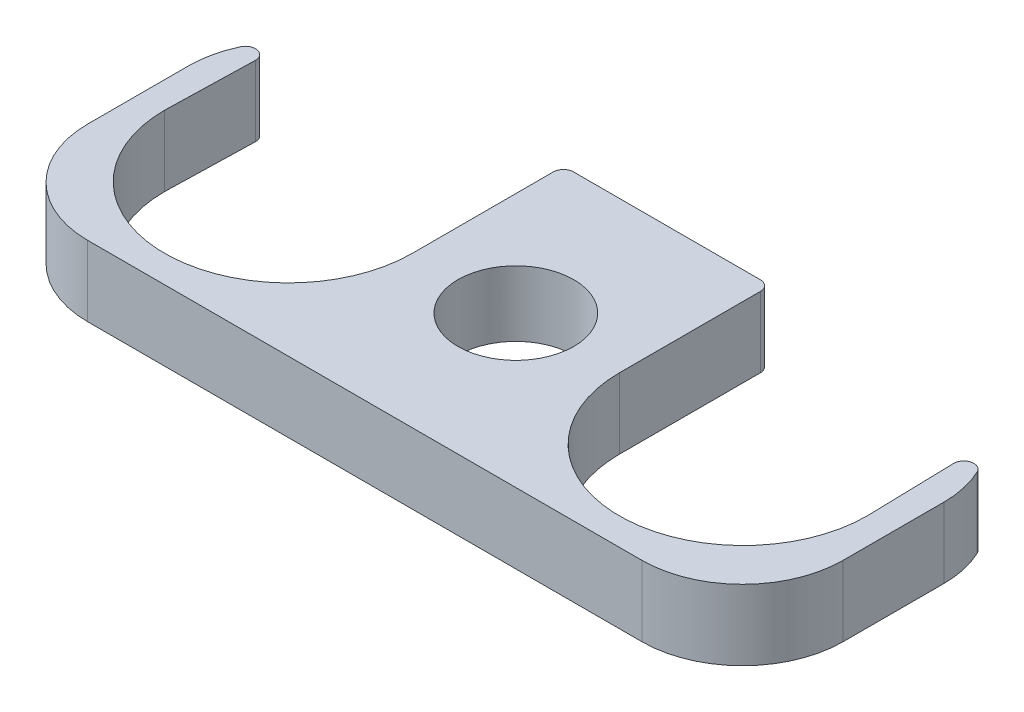
ISO-10303-21;
HEADER;
FILE_DESCRIPTION(('STEP AP214'),'2;1');
FILE_NAME('part.step','',(''),(''),'','','');
FILE_SCHEMA(('AUTOMOTIVE_DESIGN { 1 0 10303 214 1 1 1 1 }'));
ENDSEC;
DATA;
#1=APPLICATION_CONTEXT('core data for automotive mechanical design processes');
#2=APPLICATION_PROTOCOL_DEFINITION('international standard','automotive_design',2000,#1);
#3=PRODUCT_CONTEXT('',#1,'mechanical');
#4=PRODUCT('Part','Part','',(#3));
#5=PRODUCT_RELATED_PRODUCT_CATEGORY('part','',(#4));
#6=PRODUCT_DEFINITION_FORMATION('','',#4);
#7=PRODUCT_DEFINITION_CONTEXT('part definition',#1,'design');
#8=PRODUCT_DEFINITION('design','',#6,#7);
#9=PRODUCT_DEFINITION_SHAPE('','',#8);
#10=(LENGTH_UNIT() NAMED_UNIT(*) SI_UNIT(.MILLI.,.METRE.));
#11=(NAMED_UNIT(*) PLANE_ANGLE_UNIT() SI_UNIT($,.RADIAN.));
#12=(NAMED_UNIT(*) SI_UNIT($,.STERADIAN.) SOLID_ANGLE_UNIT());
#13=UNCERTAINTY_MEASURE_WITH_UNIT(LENGTH_MEASURE(1.E-05),#10,'distance_accuracy_value','');
#14=(GEOMETRIC_REPRESENTATION_CONTEXT(3) GLOBAL_UNCERTAINTY_ASSIGNED_CONTEXT((#13)) GLOBAL_UNIT_ASSIGNED_CONTEXT((#10,
#11,#12)) REPRESENTATION_CONTEXT('',''));
#15=CARTESIAN_POINT('',(0.,0.,0.));
#16=DIRECTION('',(0.,0.,1.));
#17=DIRECTION('',(1.,0.,0.));
#18=AXIS2_PLACEMENT_3D('',#15,#16,#17);
#19=CARTESIAN_POINT('',(0.,7.,0.));
#20=DIRECTION('',(0.,-1.,0.));
#21=DIRECTION('',(0.,0.,-1.));
#22=AXIS2_PLACEMENT_3D('',#19,#20,#21);
#23=CYLINDRICAL_SURFACE('',#22,5.75);
#24=CARTESIAN_POINT('',(0.,7.,0.));
#25=DIRECTION('',(0.,1.,0.));
#26=DIRECTION('',(0.,0.,1.));
#27=AXIS2_PLACEMENT_3D('',#24,#25,#26);
#28=CIRCLE('',#27,5.75);
#29=CARTESIAN_POINT('',(0.,7.,5.75));
#30=VERTEX_POINT('',#29);
#31=EDGE_CURVE('E297',#30,#30,#28,.T.);
#32=ORIENTED_EDGE('',*,*,#31,.T.);
#33=EDGE_LOOP('',(#32));
#34=FACE_BOUND('',#33,.T.);
#35=CARTESIAN_POINT('',(0.,0.5,0.));
#36=DIRECTION('',(0.,-1.,0.));
#37=DIRECTION('',(0.,0.,-1.));
#38=AXIS2_PLACEMENT_3D('',#35,#36,#37);
#39=CIRCLE('',#38,5.75);
#40=CARTESIAN_POINT('',(0.,0.5,-5.75));
#41=VERTEX_POINT('',#40);
#42=EDGE_CURVE('E44',#41,#41,#39,.T.);
#43=ORIENTED_EDGE('',*,*,#42,.T.);
#44=EDGE_LOOP('',(#43));
#45=FACE_BOUND('',#44,.T.);
#46=ADVANCED_FACE('F41',(#34,#45),#23,.F.);
#47=CARTESIAN_POINT('',(35.6536683910672,7.,-8.81020888777915));
#48=DIRECTION('',(0.,-1.,0.));
#49=DIRECTION('',(0.,0.,-1.));
#50=AXIS2_PLACEMENT_3D('',#47,#48,#49);
#51=CYLINDRICAL_SURFACE('',#50,1.);
#52=DIRECTION('',(0.,1.,0.));
#53=VECTOR('',#52,1.);
#54=CARTESIAN_POINT('',(34.6539865991295,7.,-8.78498360545808));
#55=LINE('',#54,#53);
#56=CARTESIAN_POINT('',(34.6539865991295,7.,-8.78498360545807));
#57=VERTEX_POINT('',#56);
#58=CARTESIAN_POINT('',(34.6539865991295,0.,-8.78498360545807));
#59=VERTEX_POINT('',#58);
#60=EDGE_CURVE('E383',#57,#59,#55,.F.);
#61=ORIENTED_EDGE('',*,*,#60,.F.);
#62=CARTESIAN_POINT('',(35.6536683910672,7.,-8.81020888777915));
#63=DIRECTION('',(0.,-1.,0.));
#64=DIRECTION('',(0.,0.,-1.));
#65=AXIS2_PLACEMENT_3D('',#62,#63,#64);
#66=CIRCLE('',#65,1.);
#67=CARTESIAN_POINT('',(36.5596315456303,7.,-9.23356543086571));
#68=VERTEX_POINT('',#67);
#69=EDGE_CURVE('E49',#68,#57,#66,.F.);
#70=ORIENTED_EDGE('',*,*,#69,.F.);
#71=DIRECTION('',(0.,-1.,0.));
#72=VECTOR('',#71,1.);
#73=CARTESIAN_POINT('',(36.5596315456303,7.,-9.23356543086571));
#74=LINE('',#73,#72);
#75=CARTESIAN_POINT('',(36.5596315456303,0.,-9.23356543086571));
#76=VERTEX_POINT('',#75);
#77=EDGE_CURVE('E390',#76,#68,#74,.F.);
#78=ORIENTED_EDGE('',*,*,#77,.F.);
#79=CARTESIAN_POINT('',(35.6536683910672,0.,-8.81020888777915));
#80=DIRECTION('',(0.,-1.,0.));
#81=DIRECTION('',(0.,0.,-1.));
#82=AXIS2_PLACEMENT_3D('',#79,#80,#81);
#83=CIRCLE('',#82,1.);
#84=EDGE_CURVE('E11',#59,#76,#83,.T.);
#85=ORIENTED_EDGE('',*,*,#84,.F.);
#86=EDGE_LOOP('',(#61,#70,#78,#85));
#87=FACE_BOUND('',#86,.T.);
#88=ADVANCED_FACE('F43',(#87),#51,.T.);
#89=CARTESIAN_POINT('',(9.27566082929035,7.,-14.));
#90=DIRECTION('',(0.,1.,0.));
#91=DIRECTION('',(0.,0.,1.));
#92=AXIS2_PLACEMENT_3D('',#89,#90,#91);
#93=CYLINDRICAL_SURFACE('',#92,1.);
#94=DIRECTION('',(0.,-1.,0.));
#95=VECTOR('',#94,1.);
#96=CARTESIAN_POINT('',(9.27566082929035,7.,-15.));
#97=LINE('',#96,#95);
#98=CARTESIAN_POINT('',(9.27566082929033,7.,-15.));
#99=VERTEX_POINT('',#98);
#100=CARTESIAN_POINT('',(9.27566082929033,0.,-15.));
#101=VERTEX_POINT('',#100);
#102=EDGE_CURVE('E372',#99,#101,#97,.T.);
#103=ORIENTED_EDGE('',*,*,#102,.F.);
#104=CARTESIAN_POINT('',(9.27566082929035,7.,-14.));
#105=DIRECTION('',(0.,-1.,0.));
#106=DIRECTION('',(0.,0.,-1.));
#107=AXIS2_PLACEMENT_3D('',#104,#105,#106);
#108=CIRCLE('',#107,1.);
#109=CARTESIAN_POINT('',(10.2756608292903,7.,-14.));
#110=VERTEX_POINT('',#109);
#111=EDGE_CURVE('E379',#110,#99,#108,.F.);
#112=ORIENTED_EDGE('',*,*,#111,.F.);
#113=DIRECTION('',(0.,-1.,0.));
#114=VECTOR('',#113,1.);
#115=CARTESIAN_POINT('',(10.2756608292903,7.,-14.));
#116=LINE('',#115,#114);
#117=CARTESIAN_POINT('',(10.2756608292903,0.,-14.));
#118=VERTEX_POINT('',#117);
#119=EDGE_CURVE('E380',#118,#110,#116,.F.);
#120=ORIENTED_EDGE('',*,*,#119,.F.);
#121=CARTESIAN_POINT('',(9.27566082929035,0.,-14.));
#122=DIRECTION('',(0.,-1.,0.));
#123=DIRECTION('',(0.,0.,-1.));
#124=AXIS2_PLACEMENT_3D('',#121,#122,#123);
#125=CIRCLE('',#124,1.);
#126=EDGE_CURVE('E385',#101,#118,#125,.T.);
#127=ORIENTED_EDGE('',*,*,#126,.F.);
#128=EDGE_LOOP('',(#103,#112,#120,#127));
#129=FACE_BOUND('',#128,.T.);
#130=ADVANCED_FACE('F412',(#129),#93,.T.);
#131=CARTESIAN_POINT('',(-27.4999999999999,7.,-15.));
#132=DIRECTION('',(0.,0.,1.));
#133=DIRECTION('',(1.,0.,0.));
#134=AXIS2_PLACEMENT_3D('',#131,#132,#133);
#135=PLANE('',#134);
#136=DIRECTION('',(-1.,0.,0.));
#137=VECTOR('',#136,1.);
#138=CARTESIAN_POINT('',(-27.4999999999999,7.,-15.));
#139=LINE('',#138,#137);
#140=CARTESIAN_POINT('',(-9.27566082929036,7.,-15.));
#141=VERTEX_POINT('',#140);
#142=EDGE_CURVE('E303',#99,#141,#139,.T.);
#143=ORIENTED_EDGE('',*,*,#142,.F.);
#144=ORIENTED_EDGE('',*,*,#102,.T.);
#145=DIRECTION('',(-1.,0.,0.));
#146=VECTOR('',#145,1.);
#147=CARTESIAN_POINT('',(-27.4999999999999,0.,-15.));
#148=LINE('',#147,#146);
#149=CARTESIAN_POINT('',(-9.27566082929036,0.,-15.));
#150=VERTEX_POINT('',#149);
#151=EDGE_CURVE('E323',#101,#150,#148,.T.);
#152=ORIENTED_EDGE('',*,*,#151,.T.);
#153=DIRECTION('',(0.,-1.,0.));
#154=VECTOR('',#153,1.);
#155=CARTESIAN_POINT('',(-9.27566082929035,7.,-15.));
#156=LINE('',#155,#154);
#157=EDGE_CURVE('E368',#150,#141,#156,.F.);
#158=ORIENTED_EDGE('',*,*,#157,.T.);
#159=EDGE_LOOP('',(#143,#144,#152,#158));
#160=FACE_BOUND('',#159,.T.);
#161=ADVANCED_FACE('F413',(#160),#135,.F.);
#162=CARTESIAN_POINT('',(27.5,7.,-5.00000000000002));
#163=DIRECTION('',(0.,-1.,0.));
#164=DIRECTION('',(0.,0.,-1.));
#165=AXIS2_PLACEMENT_3D('',#162,#163,#164);
#166=CYLINDRICAL_SURFACE('',#165,10.);
#167=CARTESIAN_POINT('',(27.5,0.,-5.00000000000002));
#168=DIRECTION('',(0.,1.,0.));
#169=DIRECTION('',(0.,0.,-1.));
#170=AXIS2_PLACEMENT_3D('',#167,#168,#169);
#171=CIRCLE('',#170,10.);
#172=CARTESIAN_POINT('',(37.5,0.,-4.99999999999995));
#173=VERTEX_POINT('',#172);
#174=EDGE_CURVE('E302',#173,#76,#171,.T.);
#175=ORIENTED_EDGE('',*,*,#174,.T.);
#176=ORIENTED_EDGE('',*,*,#77,.T.);
#177=CARTESIAN_POINT('',(27.5,7.,-5.00000000000002));
#178=DIRECTION('',(0.,1.,0.));
#179=DIRECTION('',(0.,0.,-1.));
#180=AXIS2_PLACEMENT_3D('',#177,#178,#179);
#181=CIRCLE('',#180,10.);
#182=CARTESIAN_POINT('',(37.5,7.,-4.99999999999995));
#183=VERTEX_POINT('',#182);
#184=EDGE_CURVE('E304',#183,#68,#181,.T.);
#185=ORIENTED_EDGE('',*,*,#184,.F.);
#186=DIRECTION('',(0.,-1.,0.));
#187=VECTOR('',#186,1.);
#188=CARTESIAN_POINT('',(37.5,7.,-4.99999999999995));
#189=LINE('',#188,#187);
#190=EDGE_CURVE('E319',#183,#173,#189,.T.);
#191=ORIENTED_EDGE('',*,*,#190,.T.);
#192=EDGE_LOOP('',(#175,#176,#185,#191));
#193=FACE_BOUND('',#192,.T.);
#194=ADVANCED_FACE('F466',(#193),#166,.T.);
#195=CARTESIAN_POINT('',(-9.27566082929035,0.,-14.));
#196=DIRECTION('',(0.,-1.,0.));
#197=DIRECTION('',(0.,0.,-1.));
#198=AXIS2_PLACEMENT_3D('',#195,#196,#197);
#199=CYLINDRICAL_SURFACE('',#198,1.);
#200=DIRECTION('',(0.,-1.,0.));
#201=VECTOR('',#200,1.);
#202=CARTESIAN_POINT('',(-10.2756608292904,0.,-14.));
#203=LINE('',#202,#201);
#204=CARTESIAN_POINT('',(-10.2756608292904,7.,-14.));
#205=VERTEX_POINT('',#204);
#206=CARTESIAN_POINT('',(-10.2756608292904,0.,-14.));
#207=VERTEX_POINT('',#206);
#208=EDGE_CURVE('E361',#205,#207,#203,.T.);
#209=ORIENTED_EDGE('',*,*,#208,.F.);
#210=CARTESIAN_POINT('',(-9.27566082929035,7.,-14.));
#211=DIRECTION('',(0.,-1.,0.));
#212=DIRECTION('',(0.,0.,-1.));
#213=AXIS2_PLACEMENT_3D('',#210,#211,#212);
#214=CIRCLE('',#213,1.);
#215=EDGE_CURVE('E369',#141,#205,#214,.F.);
#216=ORIENTED_EDGE('',*,*,#215,.F.);
#217=ORIENTED_EDGE('',*,*,#157,.F.);
#218=CARTESIAN_POINT('',(-9.27566082929035,0.,-14.));
#219=DIRECTION('',(0.,-1.,0.));
#220=DIRECTION('',(0.,0.,-1.));
#221=AXIS2_PLACEMENT_3D('',#218,#219,#220);
#222=CIRCLE('',#221,1.);
#223=EDGE_CURVE('E371',#207,#150,#222,.T.);
#224=ORIENTED_EDGE('',*,*,#223,.F.);
#225=EDGE_LOOP('',(#209,#216,#217,#224));
#226=FACE_BOUND('',#225,.T.);
#227=ADVANCED_FACE('F423',(#226),#199,.T.);
#228=CARTESIAN_POINT('',(-35.6536683910673,7.,-8.81020888777911));
#229=DIRECTION('',(0.,-1.,0.));
#230=DIRECTION('',(0.,0.,-1.));
#231=AXIS2_PLACEMENT_3D('',#228,#229,#230);
#232=CYLINDRICAL_SURFACE('',#231,1.);
#233=DIRECTION('',(0.,-1.,0.));
#234=VECTOR('',#233,1.);
#235=CARTESIAN_POINT('',(-34.6539865991295,0.,-8.78498360545805));
#236=LINE('',#235,#234);
#237=CARTESIAN_POINT('',(-34.6539865991295,0.,-8.78498360545805));
#238=VERTEX_POINT('',#237);
#239=CARTESIAN_POINT('',(-34.6539865991295,7.,-8.78498360545805));
#240=VERTEX_POINT('',#239);
#241=EDGE_CURVE('E354',#238,#240,#236,.F.);
#242=ORIENTED_EDGE('',*,*,#241,.F.);
#243=CARTESIAN_POINT('',(-35.6536683910673,0.,-8.81020888777911));
#244=DIRECTION('',(0.,-1.,0.));
#245=DIRECTION('',(0.,0.,-1.));
#246=AXIS2_PLACEMENT_3D('',#243,#244,#245);
#247=CIRCLE('',#246,1.);
#248=CARTESIAN_POINT('',(-36.5596315456303,0.,-9.23356543086568));
#249=VERTEX_POINT('',#248);
#250=EDGE_CURVE('E356',#249,#238,#247,.T.);
#251=ORIENTED_EDGE('',*,*,#250,.F.);
#252=DIRECTION('',(0.,-1.,0.));
#253=VECTOR('',#252,1.);
#254=CARTESIAN_POINT('',(-36.5596315456303,7.,-9.23356543086568));
#255=LINE('',#254,#253);
#256=CARTESIAN_POINT('',(-36.5596315456303,7.,-9.23356543086568));
#257=VERTEX_POINT('',#256);
#258=EDGE_CURVE('E357',#257,#249,#255,.T.);
#259=ORIENTED_EDGE('',*,*,#258,.F.);
#260=CARTESIAN_POINT('',(-35.6536683910673,7.,-8.81020888777911));
#261=DIRECTION('',(0.,-1.,0.));
#262=DIRECTION('',(0.,0.,-1.));
#263=AXIS2_PLACEMENT_3D('',#260,#261,#262);
#264=CIRCLE('',#263,1.);
#265=EDGE_CURVE('E363',#240,#257,#264,.F.);
#266=ORIENTED_EDGE('',*,*,#265,.F.);
#267=EDGE_LOOP('',(#242,#251,#259,#266));
#268=FACE_BOUND('',#267,.T.);
#269=ADVANCED_FACE('F436',(#268),#232,.T.);
#270=CARTESIAN_POINT('',(27.5,7.,-5.00000000000002));
#271=DIRECTION('',(0.,-1.,0.));
#272=DIRECTION('',(0.,0.,-1.));
#273=AXIS2_PLACEMENT_3D('',#270,#271,#272);
#274=PLANE('',#273);
#275=ORIENTED_EDGE('',*,*,#184,.T.);
#276=ORIENTED_EDGE('',*,*,#69,.T.);
#277=DIRECTION('',(0.0252252823210637,0.,0.999681791937726));
#278=VECTOR('',#277,1.);
#279=CARTESIAN_POINT('',(34.8756608292904,7.,0.));
#280=LINE('',#279,#278);
#281=CARTESIAN_POINT('',(34.8756608292904,7.,0.));
#282=VERTEX_POINT('',#281);
#283=EDGE_CURVE('E268',#57,#282,#280,.T.);
#284=ORIENTED_EDGE('',*,*,#283,.T.);
#285=CARTESIAN_POINT('',(22.5756608292904,7.,0.));
#286=DIRECTION('',(0.,-1.,0.));
#287=DIRECTION('',(0.,0.,1.));
#288=AXIS2_PLACEMENT_3D('',#285,#286,#287);
#289=CIRCLE('',#288,12.3);
#290=CARTESIAN_POINT('',(10.2756608292904,7.,0.));
#291=VERTEX_POINT('',#290);
#292=EDGE_CURVE('E264',#282,#291,#289,.T.);
#293=ORIENTED_EDGE('',*,*,#292,.T.);
#294=DIRECTION('',(0.,0.,-1.));
#295=VECTOR('',#294,1.);
#296=CARTESIAN_POINT('',(10.2756608292904,7.,0.));
#297=LINE('',#296,#295);
#298=EDGE_CURVE('E259',#291,#110,#297,.T.);
#299=ORIENTED_EDGE('',*,*,#298,.T.);
#300=ORIENTED_EDGE('',*,*,#111,.T.);
#301=ORIENTED_EDGE('',*,*,#142,.T.);
#302=ORIENTED_EDGE('',*,*,#215,.T.);
#303=DIRECTION('',(0.,0.,-1.));
#304=VECTOR('',#303,1.);
#305=CARTESIAN_POINT('',(-10.2756608292904,7.,0.));
#306=LINE('',#305,#304);
#307=CARTESIAN_POINT('',(-10.2756608292904,7.,0.));
#308=VERTEX_POINT('',#307);
#309=EDGE_CURVE('E288',#308,#205,#306,.T.);
#310=ORIENTED_EDGE('',*,*,#309,.F.);
#311=CARTESIAN_POINT('',(-22.5756608292904,7.,0.));
#312=DIRECTION('',(0.,1.,0.));
#313=DIRECTION('',(0.,0.,1.));
#314=AXIS2_PLACEMENT_3D('',#311,#312,#313);
#315=CIRCLE('',#314,12.3);
#316=CARTESIAN_POINT('',(-34.8756608292904,7.,0.));
#317=VERTEX_POINT('',#316);
#318=EDGE_CURVE('E274',#317,#308,#315,.T.);
#319=ORIENTED_EDGE('',*,*,#318,.F.);
#320=DIRECTION('',(-0.0252252823210635,0.,0.999681791937726));
#321=VECTOR('',#320,1.);
#322=CARTESIAN_POINT('',(-34.8756608292904,7.,0.));
#323=LINE('',#322,#321);
#324=EDGE_CURVE('E282',#240,#317,#323,.T.);
#325=ORIENTED_EDGE('',*,*,#324,.F.);
#326=ORIENTED_EDGE('',*,*,#265,.T.);
#327=CARTESIAN_POINT('',(-27.5,7.,-5.00000000000001));
#328=DIRECTION('',(0.,1.,0.));
#329=DIRECTION('',(0.,0.,-1.));
#330=AXIS2_PLACEMENT_3D('',#327,#328,#329);
#331=CIRCLE('',#330,10.);
#332=CARTESIAN_POINT('',(-37.5,7.,-4.99999999999993));
#333=VERTEX_POINT('',#332);
#334=EDGE_CURVE('E306',#257,#333,#331,.T.);
#335=ORIENTED_EDGE('',*,*,#334,.T.);
#336=DIRECTION('',(0.,0.,1.));
#337=VECTOR('',#336,1.);
#338=CARTESIAN_POINT('',(-37.5,7.,4.99999999999992));
#339=LINE('',#338,#337);
#340=CARTESIAN_POINT('',(-37.5,7.,4.99999999999992));
#341=VERTEX_POINT('',#340);
#342=EDGE_CURVE('E309',#333,#341,#339,.T.);
#343=ORIENTED_EDGE('',*,*,#342,.T.);
#344=CARTESIAN_POINT('',(-27.5,7.,4.99999999999999));
#345=DIRECTION('',(0.,1.,0.));
#346=DIRECTION('',(0.,0.,-1.));
#347=AXIS2_PLACEMENT_3D('',#344,#345,#346);
#348=CIRCLE('',#347,10.);
#349=CARTESIAN_POINT('',(-27.4999999999999,7.,15.));
#350=VERTEX_POINT('',#349);
#351=EDGE_CURVE('E315',#341,#350,#348,.T.);
#352=ORIENTED_EDGE('',*,*,#351,.T.);
#353=DIRECTION('',(1.,0.,0.));
#354=VECTOR('',#353,1.);
#355=CARTESIAN_POINT('',(-27.4999999999999,7.,15.));
#356=LINE('',#355,#354);
#357=CARTESIAN_POINT('',(27.4999999999999,7.,15.));
#358=VERTEX_POINT('',#357);
#359=EDGE_CURVE('E314',#350,#358,#356,.T.);
#360=ORIENTED_EDGE('',*,*,#359,.T.);
#361=CARTESIAN_POINT('',(27.5,7.,4.99999999999999));
#362=DIRECTION('',(0.,1.,0.));
#363=DIRECTION('',(0.,0.,1.));
#364=AXIS2_PLACEMENT_3D('',#361,#362,#363);
#365=CIRCLE('',#364,10.);
#366=CARTESIAN_POINT('',(37.5,7.,4.99999999999992));
#367=VERTEX_POINT('',#366);
#368=EDGE_CURVE('E316',#358,#367,#365,.T.);
#369=ORIENTED_EDGE('',*,*,#368,.T.);
#370=DIRECTION('',(0.,0.,-1.));
#371=VECTOR('',#370,1.);
#372=CARTESIAN_POINT('',(37.5,7.,4.99999999999992));
#373=LINE('',#372,#371);
#374=EDGE_CURVE('E318',#367,#183,#373,.T.);
#375=ORIENTED_EDGE('',*,*,#374,.T.);
#376=EDGE_LOOP('',(#275,#276,#284,#293,#299,#300,#301,#302,#310,#319,#325,#326,#335,#343,#352,
#360,#369,#375));
#377=FACE_BOUND('',#376,.T.);
#378=ORIENTED_EDGE('',*,*,#31,.F.);
#379=EDGE_LOOP('',(#378));
#380=FACE_BOUND('',#379,.T.);
#381=ADVANCED_FACE('F392',(#377,#380),#274,.F.);
#382=CARTESIAN_POINT('',(27.5,0.,-5.00000000000002));
#383=DIRECTION('',(0.,-1.,0.));
#384=DIRECTION('',(0.,0.,-1.));
#385=AXIS2_PLACEMENT_3D('',#382,#383,#384);
#386=PLANE('',#385);
#387=DIRECTION('',(-0.866025403784441,0.,0.499999999999995));
#388=VECTOR('',#387,1.);
#389=CARTESIAN_POINT('',(8.83485739148624,0.,5.10080729322667));
#390=LINE('',#389,#388);
#391=CARTESIAN_POINT('',(8.83485739148624,0.,5.10080729322667));
#392=VERTEX_POINT('',#391);
#393=CARTESIAN_POINT('',(0.,0.,10.2016145864531));
#394=VERTEX_POINT('',#393);
#395=EDGE_CURVE('E60',#392,#394,#390,.T.);
#396=ORIENTED_EDGE('',*,*,#395,.F.);
#397=DIRECTION('',(0.,0.,1.));
#398=VECTOR('',#397,1.);
#399=CARTESIAN_POINT('',(8.83485739148635,0.,-5.10080729322649));
#400=LINE('',#399,#398);
#401=CARTESIAN_POINT('',(8.83485739148635,0.,-5.10080729322649));
#402=VERTEX_POINT('',#401);
#403=EDGE_CURVE('E224',#402,#392,#400,.T.);
#404=ORIENTED_EDGE('',*,*,#403,.F.);
#405=DIRECTION('',(0.866025403784435,0.,0.500000000000007));
#406=VECTOR('',#405,1.);
#407=CARTESIAN_POINT('',(0.,0.,-10.2016145864531));
#408=LINE('',#407,#406);
#409=CARTESIAN_POINT('',(0.,0.,-10.2016145864531));
#410=VERTEX_POINT('',#409);
#411=EDGE_CURVE('E226',#410,#402,#408,.T.);
#412=ORIENTED_EDGE('',*,*,#411,.F.);
#413=DIRECTION('',(0.866025403784441,0.,-0.499999999999995));
#414=VECTOR('',#413,1.);
#415=CARTESIAN_POINT('',(-8.83485739148628,0.,-5.10080729322661));
#416=LINE('',#415,#414);
#417=CARTESIAN_POINT('',(-8.83485739148628,0.,-5.10080729322661));
#418=VERTEX_POINT('',#417);
#419=EDGE_CURVE('E242',#418,#410,#416,.T.);
#420=ORIENTED_EDGE('',*,*,#419,.F.);
#421=DIRECTION('',(0.,0.,-1.));
#422=VECTOR('',#421,1.);
#423=CARTESIAN_POINT('',(-8.83485739148631,0.,5.10080729322655));
#424=LINE('',#423,#422);
#425=CARTESIAN_POINT('',(-8.83485739148631,0.,5.10080729322655));
#426=VERTEX_POINT('',#425);
#427=EDGE_CURVE('E239',#426,#418,#424,.T.);
#428=ORIENTED_EDGE('',*,*,#427,.F.);
#429=DIRECTION('',(-0.866025403784438,0.,-0.500000000000001));
#430=VECTOR('',#429,1.);
#431=CARTESIAN_POINT('',(0.,0.,10.2016145864531));
#432=LINE('',#431,#430);
#433=EDGE_CURVE('E240',#394,#426,#432,.T.);
#434=ORIENTED_EDGE('',*,*,#433,.F.);
#435=EDGE_LOOP('',(#396,#404,#412,#420,#428,#434));
#436=FACE_BOUND('',#435,.T.);
#437=DIRECTION('',(0.0252252823210637,0.,0.999681791937726));
#438=VECTOR('',#437,1.);
#439=CARTESIAN_POINT('',(34.8756608292904,0.,0.));
#440=LINE('',#439,#438);
#441=CARTESIAN_POINT('',(34.8756608292904,0.,0.));
#442=VERTEX_POINT('',#441);
#443=EDGE_CURVE('E256',#59,#442,#440,.T.);
#444=ORIENTED_EDGE('',*,*,#443,.F.);
#445=ORIENTED_EDGE('',*,*,#84,.T.);
#446=ORIENTED_EDGE('',*,*,#174,.F.);
#447=DIRECTION('',(0.,0.,-1.));
#448=VECTOR('',#447,1.);
#449=CARTESIAN_POINT('',(37.5,0.,4.99999999999992));
#450=LINE('',#449,#448);
#451=CARTESIAN_POINT('',(37.5,0.,4.99999999999992));
#452=VERTEX_POINT('',#451);
#453=EDGE_CURVE('E308',#452,#173,#450,.T.);
#454=ORIENTED_EDGE('',*,*,#453,.F.);
#455=CARTESIAN_POINT('',(27.5,0.,4.99999999999999));
#456=DIRECTION('',(0.,1.,0.));
#457=DIRECTION('',(0.,0.,1.));
#458=AXIS2_PLACEMENT_3D('',#455,#456,#457);
#459=CIRCLE('',#458,10.);
#460=CARTESIAN_POINT('',(27.4999999999999,0.,15.));
#461=VERTEX_POINT('',#460);
#462=EDGE_CURVE('E334',#461,#452,#459,.T.);
#463=ORIENTED_EDGE('',*,*,#462,.F.);
#464=DIRECTION('',(1.,0.,0.));
#465=VECTOR('',#464,1.);
#466=CARTESIAN_POINT('',(-27.4999999999999,0.,15.));
#467=LINE('',#466,#465);
#468=CARTESIAN_POINT('',(-27.4999999999999,0.,15.));
#469=VERTEX_POINT('',#468);
#470=EDGE_CURVE('E332',#469,#461,#467,.T.);
#471=ORIENTED_EDGE('',*,*,#470,.F.);
#472=CARTESIAN_POINT('',(-27.5,0.,4.99999999999999));
#473=DIRECTION('',(0.,1.,0.));
#474=DIRECTION('',(0.,0.,-1.));
#475=AXIS2_PLACEMENT_3D('',#472,#473,#474);
#476=CIRCLE('',#475,10.);
#477=CARTESIAN_POINT('',(-37.5,0.,4.99999999999992));
#478=VERTEX_POINT('',#477);
#479=EDGE_CURVE('E328',#478,#469,#476,.T.);
#480=ORIENTED_EDGE('',*,*,#479,.F.);
#481=DIRECTION('',(0.,0.,1.));
#482=VECTOR('',#481,1.);
#483=CARTESIAN_POINT('',(-37.5,0.,4.99999999999992));
#484=LINE('',#483,#482);
#485=CARTESIAN_POINT('',(-37.5,0.,-4.99999999999993));
#486=VERTEX_POINT('',#485);
#487=EDGE_CURVE('E330',#486,#478,#484,.T.);
#488=ORIENTED_EDGE('',*,*,#487,.F.);
#489=CARTESIAN_POINT('',(-27.5,0.,-5.00000000000001));
#490=DIRECTION('',(0.,1.,0.));
#491=DIRECTION('',(0.,0.,-1.));
#492=AXIS2_PLACEMENT_3D('',#489,#490,#491);
#493=CIRCLE('',#492,10.);
#494=EDGE_CURVE('E324',#249,#486,#493,.T.);
#495=ORIENTED_EDGE('',*,*,#494,.F.);
#496=ORIENTED_EDGE('',*,*,#250,.T.);
#497=DIRECTION('',(-0.0252252823210635,0.,0.999681791937726));
#498=VECTOR('',#497,1.);
#499=CARTESIAN_POINT('',(-34.8756608292904,0.,0.));
#500=LINE('',#499,#498);
#501=CARTESIAN_POINT('',(-34.8756608292904,0.,0.));
#502=VERTEX_POINT('',#501);
#503=EDGE_CURVE('E285',#238,#502,#500,.T.);
#504=ORIENTED_EDGE('',*,*,#503,.T.);
#505=CARTESIAN_POINT('',(-22.5756608292904,0.,0.));
#506=DIRECTION('',(0.,1.,0.));
#507=DIRECTION('',(0.,0.,1.));
#508=AXIS2_PLACEMENT_3D('',#505,#506,#507);
#509=CIRCLE('',#508,12.3);
#510=CARTESIAN_POINT('',(-10.2756608292904,0.,0.));
#511=VERTEX_POINT('',#510);
#512=EDGE_CURVE('E279',#502,#511,#509,.T.);
#513=ORIENTED_EDGE('',*,*,#512,.T.);
#514=DIRECTION('',(0.,0.,-1.));
#515=VECTOR('',#514,1.);
#516=CARTESIAN_POINT('',(-10.2756608292904,0.,0.));
#517=LINE('',#516,#515);
#518=EDGE_CURVE('E281',#511,#207,#517,.T.);
#519=ORIENTED_EDGE('',*,*,#518,.T.);
#520=ORIENTED_EDGE('',*,*,#223,.T.);
#521=ORIENTED_EDGE('',*,*,#151,.F.);
#522=ORIENTED_EDGE('',*,*,#126,.T.);
#523=DIRECTION('',(0.,0.,-1.));
#524=VECTOR('',#523,1.);
#525=CARTESIAN_POINT('',(10.2756608292904,0.,0.));
#526=LINE('',#525,#524);
#527=CARTESIAN_POINT('',(10.2756608292904,0.,0.));
#528=VERTEX_POINT('',#527);
#529=EDGE_CURVE('E261',#528,#118,#526,.T.);
#530=ORIENTED_EDGE('',*,*,#529,.F.);
#531=CARTESIAN_POINT('',(22.5756608292904,0.,0.));
#532=DIRECTION('',(0.,-1.,0.));
#533=DIRECTION('',(0.,0.,1.));
#534=AXIS2_PLACEMENT_3D('',#531,#532,#533);
#535=CIRCLE('',#534,12.3);
#536=EDGE_CURVE('E258',#442,#528,#535,.T.);
#537=ORIENTED_EDGE('',*,*,#536,.F.);
#538=EDGE_LOOP('',(#444,#445,#446,#454,#463,#471,#480,#488,#495,#496,#504,#513,#519,#520,#521,
#522,#530,#537));
#539=FACE_BOUND('',#538,.T.);
#540=ADVANCED_FACE('F468',(#436,#539),#386,.T.);
#541=CARTESIAN_POINT('',(-27.5,7.,-5.00000000000001));
#542=DIRECTION('',(0.,-1.,0.));
#543=DIRECTION('',(0.,0.,-1.));
#544=AXIS2_PLACEMENT_3D('',#541,#542,#543);
#545=CYLINDRICAL_SURFACE('',#544,10.);
#546=ORIENTED_EDGE('',*,*,#334,.F.);
#547=ORIENTED_EDGE('',*,*,#258,.T.);
#548=ORIENTED_EDGE('',*,*,#494,.T.);
#549=DIRECTION('',(0.,-1.,0.));
#550=VECTOR('',#549,1.);
#551=CARTESIAN_POINT('',(-37.5,7.,-4.99999999999993));
#552=LINE('',#551,#550);
#553=EDGE_CURVE('E348',#333,#486,#552,.T.);
#554=ORIENTED_EDGE('',*,*,#553,.F.);
#555=EDGE_LOOP('',(#546,#547,#548,#554));
#556=FACE_BOUND('',#555,.T.);
#557=ADVANCED_FACE('F444',(#556),#545,.T.);
#558=CARTESIAN_POINT('',(-37.5,7.,4.99999999999992));
#559=DIRECTION('',(1.,0.,0.));
#560=DIRECTION('',(0.,0.,-1.));
#561=AXIS2_PLACEMENT_3D('',#558,#559,#560);
#562=PLANE('',#561);
#563=ORIENTED_EDGE('',*,*,#487,.T.);
#564=DIRECTION('',(0.,-1.,0.));
#565=VECTOR('',#564,1.);
#566=CARTESIAN_POINT('',(-37.5,7.,4.99999999999992));
#567=LINE('',#566,#565);
#568=EDGE_CURVE('E350',#341,#478,#567,.T.);
#569=ORIENTED_EDGE('',*,*,#568,.F.);
#570=ORIENTED_EDGE('',*,*,#342,.F.);
#571=ORIENTED_EDGE('',*,*,#553,.T.);
#572=EDGE_LOOP('',(#563,#569,#570,#571));
#573=FACE_BOUND('',#572,.T.);
#574=ADVANCED_FACE('F447',(#573),#562,.F.);
#575=CARTESIAN_POINT('',(-27.5,7.,4.99999999999999));
#576=DIRECTION('',(0.,-1.,0.));
#577=DIRECTION('',(0.,0.,-1.));
#578=AXIS2_PLACEMENT_3D('',#575,#576,#577);
#579=CYLINDRICAL_SURFACE('',#578,10.);
#580=ORIENTED_EDGE('',*,*,#479,.T.);
#581=DIRECTION('',(0.,-1.,0.));
#582=VECTOR('',#581,1.);
#583=CARTESIAN_POINT('',(-27.4999999999999,7.,15.));
#584=LINE('',#583,#582);
#585=EDGE_CURVE('E341',#350,#469,#584,.T.);
#586=ORIENTED_EDGE('',*,*,#585,.F.);
#587=ORIENTED_EDGE('',*,*,#351,.F.);
#588=ORIENTED_EDGE('',*,*,#568,.T.);
#589=EDGE_LOOP('',(#580,#586,#587,#588));
#590=FACE_BOUND('',#589,.T.);
#591=ADVANCED_FACE('F454',(#590),#579,.T.);
#592=CARTESIAN_POINT('',(-27.4999999999999,7.,15.));
#593=DIRECTION('',(0.,0.,-1.));
#594=DIRECTION('',(-1.,0.,0.));
#595=AXIS2_PLACEMENT_3D('',#592,#593,#594);
#596=PLANE('',#595);
#597=ORIENTED_EDGE('',*,*,#470,.T.);
#598=DIRECTION('',(0.,-1.,0.));
#599=VECTOR('',#598,1.);
#600=CARTESIAN_POINT('',(27.4999999999999,7.,15.));
#601=LINE('',#600,#599);
#602=EDGE_CURVE('E342',#358,#461,#601,.T.);
#603=ORIENTED_EDGE('',*,*,#602,.F.);
#604=ORIENTED_EDGE('',*,*,#359,.F.);
#605=ORIENTED_EDGE('',*,*,#585,.T.);
#606=EDGE_LOOP('',(#597,#603,#604,#605));
#607=FACE_BOUND('',#606,.T.);
#608=ADVANCED_FACE('F456',(#607),#596,.F.);
#609=CARTESIAN_POINT('',(27.5,7.,4.99999999999999));
#610=DIRECTION('',(0.,-1.,0.));
#611=DIRECTION('',(0.,0.,-1.));
#612=AXIS2_PLACEMENT_3D('',#609,#610,#611);
#613=CYLINDRICAL_SURFACE('',#612,10.);
#614=ORIENTED_EDGE('',*,*,#462,.T.);
#615=DIRECTION('',(0.,-1.,0.));
#616=VECTOR('',#615,1.);
#617=CARTESIAN_POINT('',(37.5,7.,4.99999999999992));
#618=LINE('',#617,#616);
#619=EDGE_CURVE('E339',#367,#452,#618,.T.);
#620=ORIENTED_EDGE('',*,*,#619,.F.);
#621=ORIENTED_EDGE('',*,*,#368,.F.);
#622=ORIENTED_EDGE('',*,*,#602,.T.);
#623=EDGE_LOOP('',(#614,#620,#621,#622));
#624=FACE_BOUND('',#623,.T.);
#625=ADVANCED_FACE('F462',(#624),#613,.T.);
#626=CARTESIAN_POINT('',(37.5,7.,4.99999999999992));
#627=DIRECTION('',(-1.,0.,0.));
#628=DIRECTION('',(0.,0.,1.));
#629=AXIS2_PLACEMENT_3D('',#626,#627,#628);
#630=PLANE('',#629);
#631=ORIENTED_EDGE('',*,*,#453,.T.);
#632=ORIENTED_EDGE('',*,*,#190,.F.);
#633=ORIENTED_EDGE('',*,*,#374,.F.);
#634=ORIENTED_EDGE('',*,*,#619,.T.);
#635=EDGE_LOOP('',(#631,#632,#633,#634));
#636=FACE_BOUND('',#635,.T.);
#637=ADVANCED_FACE('F469',(#636),#630,.F.);
#638=CARTESIAN_POINT('',(-22.5756608292904,0.,0.));
#639=DIRECTION('',(0.,1.,0.));
#640=DIRECTION('',(0.,0.,1.));
#641=AXIS2_PLACEMENT_3D('',#638,#639,#640);
#642=CYLINDRICAL_SURFACE('',#641,12.3);
#643=ORIENTED_EDGE('',*,*,#318,.T.);
#644=DIRECTION('',(0.,1.,0.));
#645=VECTOR('',#644,1.);
#646=CARTESIAN_POINT('',(-10.2756608292904,0.,0.));
#647=LINE('',#646,#645);
#648=EDGE_CURVE('E289',#511,#308,#647,.T.);
#649=ORIENTED_EDGE('',*,*,#648,.F.);
#650=ORIENTED_EDGE('',*,*,#512,.F.);
#651=DIRECTION('',(0.,1.,0.));
#652=VECTOR('',#651,1.);
#653=CARTESIAN_POINT('',(-34.8756608292904,0.,0.));
#654=LINE('',#653,#652);
#655=EDGE_CURVE('E294',#502,#317,#654,.T.);
#656=ORIENTED_EDGE('',*,*,#655,.T.);
#657=EDGE_LOOP('',(#643,#649,#650,#656));
#658=FACE_BOUND('',#657,.T.);
#659=ADVANCED_FACE('F428',(#658),#642,.F.);
#660=CARTESIAN_POINT('',(-34.8756608292904,0.,0.));
#661=DIRECTION('',(-0.999681791937726,0.,-0.0252252823210635));
#662=DIRECTION('',(-0.0252252823210635,0.,0.999681791937726));
#663=AXIS2_PLACEMENT_3D('',#660,#661,#662);
#664=PLANE('',#663);
#665=ORIENTED_EDGE('',*,*,#503,.F.);
#666=ORIENTED_EDGE('',*,*,#241,.T.);
#667=ORIENTED_EDGE('',*,*,#324,.T.);
#668=ORIENTED_EDGE('',*,*,#655,.F.);
#669=EDGE_LOOP('',(#665,#666,#667,#668));
#670=FACE_BOUND('',#669,.T.);
#671=ADVANCED_FACE('F433',(#670),#664,.F.);
#672=CARTESIAN_POINT('',(-10.2756608292904,0.,0.));
#673=DIRECTION('',(1.,0.,0.));
#674=DIRECTION('',(0.,0.,-1.));
#675=AXIS2_PLACEMENT_3D('',#672,#673,#674);
#676=PLANE('',#675);
#677=ORIENTED_EDGE('',*,*,#309,.T.);
#678=ORIENTED_EDGE('',*,*,#208,.T.);
#679=ORIENTED_EDGE('',*,*,#518,.F.);
#680=ORIENTED_EDGE('',*,*,#648,.T.);
#681=EDGE_LOOP('',(#677,#678,#679,#680));
#682=FACE_BOUND('',#681,.T.);
#683=ADVANCED_FACE('F424',(#682),#676,.F.);
#684=CARTESIAN_POINT('',(22.5756608292904,0.,0.));
#685=DIRECTION('',(0.,1.,0.));
#686=DIRECTION('',(0.,0.,1.));
#687=AXIS2_PLACEMENT_3D('',#684,#685,#686);
#688=CYLINDRICAL_SURFACE('',#687,12.3);
#689=ORIENTED_EDGE('',*,*,#292,.F.);
#690=DIRECTION('',(0.,1.,0.));
#691=VECTOR('',#690,1.);
#692=CARTESIAN_POINT('',(34.8756608292904,0.,0.));
#693=LINE('',#692,#691);
#694=EDGE_CURVE('E262',#442,#282,#693,.T.);
#695=ORIENTED_EDGE('',*,*,#694,.F.);
#696=ORIENTED_EDGE('',*,*,#536,.T.);
#697=DIRECTION('',(0.,1.,0.));
#698=VECTOR('',#697,1.);
#699=CARTESIAN_POINT('',(10.2756608292904,0.,0.));
#700=LINE('',#699,#698);
#701=EDGE_CURVE('E275',#528,#291,#700,.T.);
#702=ORIENTED_EDGE('',*,*,#701,.T.);
#703=EDGE_LOOP('',(#689,#695,#696,#702));
#704=FACE_BOUND('',#703,.T.);
#705=ADVANCED_FACE('F401',(#704),#688,.F.);
#706=CARTESIAN_POINT('',(10.2756608292904,0.,0.));
#707=DIRECTION('',(1.,0.,0.));
#708=DIRECTION('',(0.,0.,-1.));
#709=AXIS2_PLACEMENT_3D('',#706,#707,#708);
#710=PLANE('',#709);
#711=ORIENTED_EDGE('',*,*,#529,.T.);
#712=ORIENTED_EDGE('',*,*,#119,.T.);
#713=ORIENTED_EDGE('',*,*,#298,.F.);
#714=ORIENTED_EDGE('',*,*,#701,.F.);
#715=EDGE_LOOP('',(#711,#712,#713,#714));
#716=FACE_BOUND('',#715,.T.);
#717=ADVANCED_FACE('F407',(#716),#710,.T.);
#718=CARTESIAN_POINT('',(34.8756608292904,0.,0.));
#719=DIRECTION('',(-0.999681791937726,0.,0.0252252823210637));
#720=DIRECTION('',(0.0252252823210637,0.,0.999681791937726));
#721=AXIS2_PLACEMENT_3D('',#718,#719,#720);
#722=PLANE('',#721);
#723=ORIENTED_EDGE('',*,*,#283,.F.);
#724=ORIENTED_EDGE('',*,*,#60,.T.);
#725=ORIENTED_EDGE('',*,*,#443,.T.);
#726=ORIENTED_EDGE('',*,*,#694,.T.);
#727=EDGE_LOOP('',(#723,#724,#725,#726));
#728=FACE_BOUND('',#727,.T.);
#729=ADVANCED_FACE('F400',(#728),#722,.T.);
#730=CARTESIAN_POINT('',(8.83485739148624,0.5,5.10080729322667));
#731=DIRECTION('',(0.499999999999995,0.,0.866025403784441));
#732=DIRECTION('',(0.866025403784441,0.,-0.499999999999995));
#733=AXIS2_PLACEMENT_3D('',#730,#731,#732);
#734=PLANE('',#733);
#735=ORIENTED_EDGE('',*,*,#395,.T.);
#736=DIRECTION('',(0.,-1.,0.));
#737=VECTOR('',#736,1.);
#738=CARTESIAN_POINT('',(0.,0.5,10.2016145864531));
#739=LINE('',#738,#737);
#740=CARTESIAN_POINT('',(0.,0.5,10.2016145864531));
#741=VERTEX_POINT('',#740);
#742=EDGE_CURVE('E199',#741,#394,#739,.T.);
#743=ORIENTED_EDGE('',*,*,#742,.F.);
#744=DIRECTION('',(-0.866025403784441,0.,0.499999999999995));
#745=VECTOR('',#744,1.);
#746=CARTESIAN_POINT('',(8.83485739148624,0.5,5.10080729322667));
#747=LINE('',#746,#745);
#748=CARTESIAN_POINT('',(8.83485739148624,0.5,5.10080729322667));
#749=VERTEX_POINT('',#748);
#750=EDGE_CURVE('E204',#749,#741,#747,.T.);
#751=ORIENTED_EDGE('',*,*,#750,.F.);
#752=DIRECTION('',(0.,-1.,0.));
#753=VECTOR('',#752,1.);
#754=CARTESIAN_POINT('',(8.83485739148624,0.5,5.10080729322667));
#755=LINE('',#754,#753);
#756=EDGE_CURVE('E249',#749,#392,#755,.T.);
#757=ORIENTED_EDGE('',*,*,#756,.T.);
#758=EDGE_LOOP('',(#735,#743,#751,#757));
#759=FACE_BOUND('',#758,.T.);
#760=ADVANCED_FACE('F205',(#759),#734,.F.);
#761=CARTESIAN_POINT('',(8.83485739148635,0.5,-5.10080729322649));
#762=DIRECTION('',(1.,0.,0.));
#763=DIRECTION('',(0.,0.,-1.));
#764=AXIS2_PLACEMENT_3D('',#761,#762,#763);
#765=PLANE('',#764);
#766=ORIENTED_EDGE('',*,*,#403,.T.);
#767=ORIENTED_EDGE('',*,*,#756,.F.);
#768=DIRECTION('',(0.,0.,1.));
#769=VECTOR('',#768,1.);
#770=CARTESIAN_POINT('',(8.83485739148635,0.5,-5.10080729322649));
#771=LINE('',#770,#769);
#772=CARTESIAN_POINT('',(8.83485739148635,0.5,-5.10080729322649));
#773=VERTEX_POINT('',#772);
#774=EDGE_CURVE('E209',#773,#749,#771,.T.);
#775=ORIENTED_EDGE('',*,*,#774,.F.);
#776=DIRECTION('',(0.,-1.,0.));
#777=VECTOR('',#776,1.);
#778=CARTESIAN_POINT('',(8.83485739148635,0.5,-5.10080729322649));
#779=LINE('',#778,#777);
#780=EDGE_CURVE('E246',#773,#402,#779,.T.);
#781=ORIENTED_EDGE('',*,*,#780,.T.);
#782=EDGE_LOOP('',(#766,#767,#775,#781));
#783=FACE_BOUND('',#782,.T.);
#784=ADVANCED_FACE('F504',(#783),#765,.F.);
#785=CARTESIAN_POINT('',(0.,0.5,-10.2016145864531));
#786=DIRECTION('',(0.500000000000007,0.,-0.866025403784435));
#787=DIRECTION('',(-0.866025403784434,0.,-0.500000000000007));
#788=AXIS2_PLACEMENT_3D('',#785,#786,#787);
#789=PLANE('',#788);
#790=ORIENTED_EDGE('',*,*,#411,.T.);
#791=ORIENTED_EDGE('',*,*,#780,.F.);
#792=DIRECTION('',(0.866025403784435,0.,0.500000000000007));
#793=VECTOR('',#792,1.);
#794=CARTESIAN_POINT('',(0.,0.5,-10.2016145864531));
#795=LINE('',#794,#793);
#796=CARTESIAN_POINT('',(0.,0.5,-10.2016145864531));
#797=VERTEX_POINT('',#796);
#798=EDGE_CURVE('E235',#797,#773,#795,.T.);
#799=ORIENTED_EDGE('',*,*,#798,.F.);
#800=DIRECTION('',(0.,-1.,0.));
#801=VECTOR('',#800,1.);
#802=CARTESIAN_POINT('',(0.,0.5,-10.2016145864531));
#803=LINE('',#802,#801);
#804=EDGE_CURVE('E253',#797,#410,#803,.T.);
#805=ORIENTED_EDGE('',*,*,#804,.T.);
#806=EDGE_LOOP('',(#790,#791,#799,#805));
#807=FACE_BOUND('',#806,.T.);
#808=ADVANCED_FACE('F511',(#807),#789,.F.);
#809=CARTESIAN_POINT('',(-8.83485739148628,0.5,-5.10080729322661));
#810=DIRECTION('',(-0.499999999999995,0.,-0.866025403784441));
#811=DIRECTION('',(-0.866025403784442,0.,0.499999999999995));
#812=AXIS2_PLACEMENT_3D('',#809,#810,#811);
#813=PLANE('',#812);
#814=ORIENTED_EDGE('',*,*,#419,.T.);
#815=ORIENTED_EDGE('',*,*,#804,.F.);
#816=DIRECTION('',(0.866025403784441,0.,-0.499999999999995));
#817=VECTOR('',#816,1.);
#818=CARTESIAN_POINT('',(-8.83485739148628,0.5,-5.10080729322661));
#819=LINE('',#818,#817);
#820=CARTESIAN_POINT('',(-8.83485739148628,0.5,-5.10080729322661));
#821=VERTEX_POINT('',#820);
#822=EDGE_CURVE('E230',#821,#797,#819,.T.);
#823=ORIENTED_EDGE('',*,*,#822,.F.);
#824=DIRECTION('',(0.,-1.,0.));
#825=VECTOR('',#824,1.);
#826=CARTESIAN_POINT('',(-8.83485739148628,0.5,-5.10080729322661));
#827=LINE('',#826,#825);
#828=EDGE_CURVE('E251',#821,#418,#827,.T.);
#829=ORIENTED_EDGE('',*,*,#828,.T.);
#830=EDGE_LOOP('',(#814,#815,#823,#829));
#831=FACE_BOUND('',#830,.T.);
#832=ADVANCED_FACE('F506',(#831),#813,.F.);
#833=CARTESIAN_POINT('',(-8.83485739148631,0.5,5.10080729322655));
#834=DIRECTION('',(-1.,0.,0.));
#835=DIRECTION('',(0.,0.,1.));
#836=AXIS2_PLACEMENT_3D('',#833,#834,#835);
#837=PLANE('',#836);
#838=ORIENTED_EDGE('',*,*,#427,.T.);
#839=ORIENTED_EDGE('',*,*,#828,.F.);
#840=DIRECTION('',(0.,0.,-1.));
#841=VECTOR('',#840,1.);
#842=CARTESIAN_POINT('',(-8.83485739148631,0.5,5.10080729322655));
#843=LINE('',#842,#841);
#844=CARTESIAN_POINT('',(-8.83485739148631,0.5,5.10080729322655));
#845=VERTEX_POINT('',#844);
#846=EDGE_CURVE('E217',#845,#821,#843,.T.);
#847=ORIENTED_EDGE('',*,*,#846,.F.);
#848=DIRECTION('',(0.,-1.,0.));
#849=VECTOR('',#848,1.);
#850=CARTESIAN_POINT('',(-8.83485739148631,0.5,5.10080729322655));
#851=LINE('',#850,#849);
#852=EDGE_CURVE('E207',#845,#426,#851,.T.);
#853=ORIENTED_EDGE('',*,*,#852,.T.);
#854=EDGE_LOOP('',(#838,#839,#847,#853));
#855=FACE_BOUND('',#854,.T.);
#856=ADVANCED_FACE('F507',(#855),#837,.F.);
#857=CARTESIAN_POINT('',(0.,0.5,10.2016145864531));
#858=DIRECTION('',(-0.500000000000001,0.,0.866025403784438));
#859=DIRECTION('',(0.866025403784438,0.,0.500000000000001));
#860=AXIS2_PLACEMENT_3D('',#857,#858,#859);
#861=PLANE('',#860);
#862=ORIENTED_EDGE('',*,*,#433,.T.);
#863=ORIENTED_EDGE('',*,*,#852,.F.);
#864=DIRECTION('',(-0.866025403784438,0.,-0.500000000000001));
#865=VECTOR('',#864,1.);
#866=CARTESIAN_POINT('',(0.,0.5,10.2016145864531));
#867=LINE('',#866,#865);
#868=EDGE_CURVE('E213',#741,#845,#867,.T.);
#869=ORIENTED_EDGE('',*,*,#868,.F.);
#870=ORIENTED_EDGE('',*,*,#742,.T.);
#871=EDGE_LOOP('',(#862,#863,#869,#870));
#872=FACE_BOUND('',#871,.T.);
#873=ADVANCED_FACE('F212',(#872),#861,.F.);
#874=CARTESIAN_POINT('',(0.,0.5,0.));
#875=DIRECTION('',(0.,-1.,0.));
#876=DIRECTION('',(0.,0.,-1.));
#877=AXIS2_PLACEMENT_3D('',#874,#875,#876);
#878=PLANE('',#877);
#879=ORIENTED_EDGE('',*,*,#42,.F.);
#880=EDGE_LOOP('',(#879));
#881=FACE_BOUND('',#880,.T.);
#882=ORIENTED_EDGE('',*,*,#750,.T.);
#883=ORIENTED_EDGE('',*,*,#868,.T.);
#884=ORIENTED_EDGE('',*,*,#846,.T.);
#885=ORIENTED_EDGE('',*,*,#822,.T.);
#886=ORIENTED_EDGE('',*,*,#798,.T.);
#887=ORIENTED_EDGE('',*,*,#774,.T.);
#888=EDGE_LOOP('',(#882,#883,#884,#885,#886,#887));
#889=FACE_BOUND('',#888,.T.);
#890=ADVANCED_FACE('F219',(#881,#889),#878,.T.);
#891=CLOSED_SHELL('',(#46,#88,#130,#161,#194,#227,#269,#381,#540,#557,#574,#591,#608,#625,#637,
#659,#671,#683,#705,#717,#729,#760,#784,#808,#832,#856,#873,#890));
#892=MANIFOLD_SOLID_BREP('B2',#891);
#893=ADVANCED_BREP_SHAPE_REPRESENTATION('',(#18,#892),#14);
#894=SHAPE_DEFINITION_REPRESENTATION(#9,#893);
ENDSEC;
END-ISO-10303-21;
